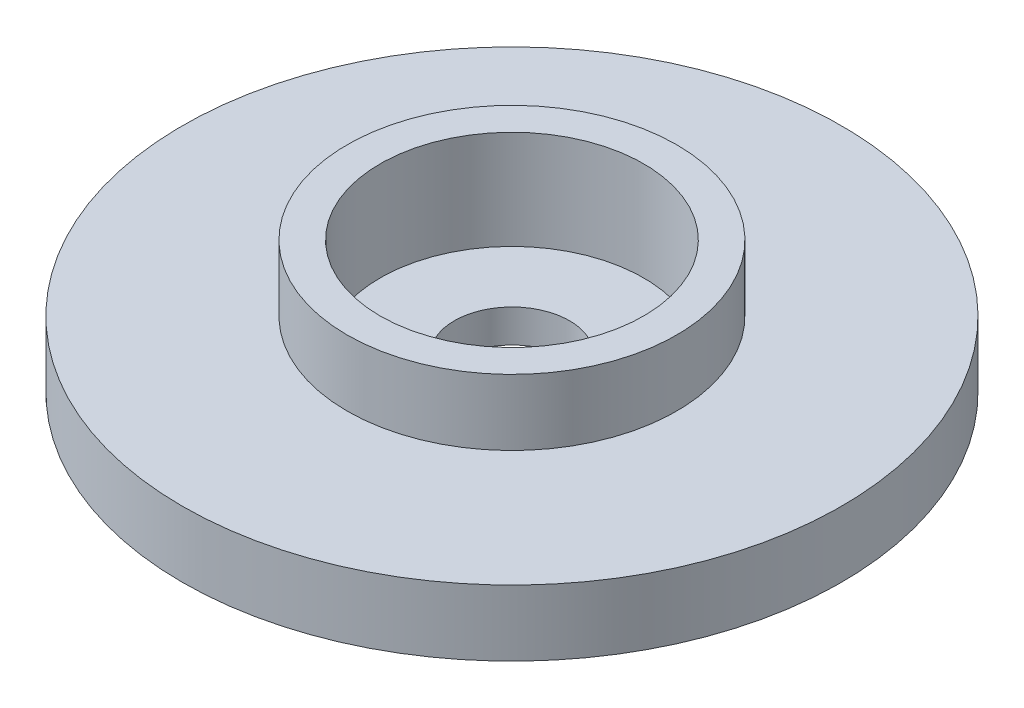
ISO-10303-21;
HEADER;
FILE_DESCRIPTION(('STEP AP214'),'2;1');
FILE_NAME('part.step','',(''),(''),'','','');
FILE_SCHEMA(('AUTOMOTIVE_DESIGN { 1 0 10303 214 1 1 1 1 }'));
ENDSEC;
DATA;
#1=APPLICATION_CONTEXT('core data for automotive mechanical design processes');
#2=APPLICATION_PROTOCOL_DEFINITION('international standard','automotive_design',2000,#1);
#3=PRODUCT_CONTEXT('',#1,'mechanical');
#4=PRODUCT('Part','Part','',(#3));
#5=PRODUCT_RELATED_PRODUCT_CATEGORY('part','',(#4));
#6=PRODUCT_DEFINITION_FORMATION('','',#4);
#7=PRODUCT_DEFINITION_CONTEXT('part definition',#1,'design');
#8=PRODUCT_DEFINITION('design','',#6,#7);
#9=PRODUCT_DEFINITION_SHAPE('','',#8);
#10=(LENGTH_UNIT() NAMED_UNIT(*) SI_UNIT(.MILLI.,.METRE.));
#11=(NAMED_UNIT(*) PLANE_ANGLE_UNIT() SI_UNIT($,.RADIAN.));
#12=(NAMED_UNIT(*) SI_UNIT($,.STERADIAN.) SOLID_ANGLE_UNIT());
#13=UNCERTAINTY_MEASURE_WITH_UNIT(LENGTH_MEASURE(1.E-05),#10,'distance_accuracy_value','');
#14=(GEOMETRIC_REPRESENTATION_CONTEXT(3) GLOBAL_UNCERTAINTY_ASSIGNED_CONTEXT((#13)) GLOBAL_UNIT_ASSIGNED_CONTEXT((#10,
#11,#12)) REPRESENTATION_CONTEXT('',''));
#15=CARTESIAN_POINT('',(0.,0.,0.));
#16=DIRECTION('',(0.,0.,1.));
#17=DIRECTION('',(1.,0.,0.));
#18=AXIS2_PLACEMENT_3D('',#15,#16,#17);
#19=CARTESIAN_POINT('',(0.,0.574222431668237,0.));
#20=DIRECTION('',(0.,1.,0.));
#21=DIRECTION('',(0.,0.,1.));
#22=AXIS2_PLACEMENT_3D('',#19,#20,#21);
#23=CYLINDRICAL_SURFACE('',#22,0.875);
#24=CARTESIAN_POINT('',(0.,0.574222431668237,0.));
#25=DIRECTION('',(0.,1.,0.));
#26=DIRECTION('',(0.,0.,1.));
#27=AXIS2_PLACEMENT_3D('',#24,#25,#26);
#28=CIRCLE('',#27,0.875);
#29=CARTESIAN_POINT('',(0.,0.574222431668237,0.875));
#30=VERTEX_POINT('',#29);
#31=EDGE_CURVE('E51',#30,#30,#28,.T.);
#32=ORIENTED_EDGE('',*,*,#31,.F.);
#33=EDGE_LOOP('',(#32));
#34=FACE_BOUND('',#33,.T.);
#35=CARTESIAN_POINT('',(0.,1.07422243166824,0.));
#36=DIRECTION('',(0.,1.,0.));
#37=DIRECTION('',(0.,0.,1.));
#38=AXIS2_PLACEMENT_3D('',#35,#36,#37);
#39=CIRCLE('',#38,0.875);
#40=CARTESIAN_POINT('',(0.,1.07422243166824,0.875));
#41=VERTEX_POINT('',#40);
#42=EDGE_CURVE('E37',#41,#41,#39,.F.);
#43=ORIENTED_EDGE('',*,*,#42,.F.);
#44=EDGE_LOOP('',(#43));
#45=FACE_BOUND('',#44,.T.);
#46=ADVANCED_FACE('F33',(#34,#45),#23,.F.);
#47=CARTESIAN_POINT('',(0.,1.57422243166824,0.));
#48=DIRECTION('',(0.,-1.,0.));
#49=DIRECTION('',(0.,0.,-1.));
#50=AXIS2_PLACEMENT_3D('',#47,#48,#49);
#51=CYLINDRICAL_SURFACE('',#50,5.);
#52=CARTESIAN_POINT('',(0.,1.57422243166824,0.));
#53=DIRECTION('',(0.,1.,0.));
#54=DIRECTION('',(0.,0.,1.));
#55=AXIS2_PLACEMENT_3D('',#52,#53,#54);
#56=CIRCLE('',#55,5.);
#57=CARTESIAN_POINT('',(0.,1.57422243166824,5.));
#58=VERTEX_POINT('',#57);
#59=EDGE_CURVE('E10',#58,#58,#56,.T.);
#60=ORIENTED_EDGE('',*,*,#59,.F.);
#61=EDGE_LOOP('',(#60));
#62=FACE_BOUND('',#61,.T.);
#63=CARTESIAN_POINT('',(0.,0.574222431668237,0.));
#64=DIRECTION('',(0.,1.,0.));
#65=DIRECTION('',(0.,0.,1.));
#66=AXIS2_PLACEMENT_3D('',#63,#64,#65);
#67=CIRCLE('',#66,5.);
#68=CARTESIAN_POINT('',(0.,0.574222431668237,5.));
#69=VERTEX_POINT('',#68);
#70=EDGE_CURVE('E41',#69,#69,#67,.T.);
#71=ORIENTED_EDGE('',*,*,#70,.T.);
#72=EDGE_LOOP('',(#71));
#73=FACE_BOUND('',#72,.T.);
#74=ADVANCED_FACE('F35',(#62,#73),#51,.T.);
#75=CARTESIAN_POINT('',(0.,1.57422243166824,0.));
#76=DIRECTION('',(0.,1.,0.));
#77=DIRECTION('',(0.,0.,1.));
#78=AXIS2_PLACEMENT_3D('',#75,#76,#77);
#79=PLANE('',#78);
#80=CARTESIAN_POINT('',(0.,1.57422243166824,0.));
#81=DIRECTION('',(0.,1.,0.));
#82=DIRECTION('',(0.,0.,1.));
#83=AXIS2_PLACEMENT_3D('',#80,#81,#82);
#84=CIRCLE('',#83,2.5);
#85=CARTESIAN_POINT('',(0.,1.57422243166824,2.5));
#86=VERTEX_POINT('',#85);
#87=EDGE_CURVE('E48',#86,#86,#84,.T.);
#88=ORIENTED_EDGE('',*,*,#87,.F.);
#89=EDGE_LOOP('',(#88));
#90=FACE_BOUND('',#89,.T.);
#91=ORIENTED_EDGE('',*,*,#59,.T.);
#92=EDGE_LOOP('',(#91));
#93=FACE_BOUND('',#92,.T.);
#94=ADVANCED_FACE('F74',(#90,#93),#79,.T.);
#95=CARTESIAN_POINT('',(0.,0.574222431668237,0.));
#96=DIRECTION('',(0.,1.,0.));
#97=DIRECTION('',(0.,0.,1.));
#98=AXIS2_PLACEMENT_3D('',#95,#96,#97);
#99=PLANE('',#98);
#100=ORIENTED_EDGE('',*,*,#31,.T.);
#101=EDGE_LOOP('',(#100));
#102=FACE_BOUND('',#101,.T.);
#103=ORIENTED_EDGE('',*,*,#70,.F.);
#104=EDGE_LOOP('',(#103));
#105=FACE_BOUND('',#104,.T.);
#106=ADVANCED_FACE('F88',(#102,#105),#99,.F.);
#107=CARTESIAN_POINT('',(0.,2.57422243166824,0.));
#108=DIRECTION('',(0.,-1.,0.));
#109=DIRECTION('',(0.,0.,-1.));
#110=AXIS2_PLACEMENT_3D('',#107,#108,#109);
#111=CYLINDRICAL_SURFACE('',#110,2.5);
#112=CARTESIAN_POINT('',(0.,2.57422243166824,0.));
#113=DIRECTION('',(0.,1.,0.));
#114=DIRECTION('',(0.,0.,1.));
#115=AXIS2_PLACEMENT_3D('',#112,#113,#114);
#116=CIRCLE('',#115,2.5);
#117=CARTESIAN_POINT('',(0.,2.57422243166824,2.5));
#118=VERTEX_POINT('',#117);
#119=EDGE_CURVE('E46',#118,#118,#116,.T.);
#120=ORIENTED_EDGE('',*,*,#119,.F.);
#121=EDGE_LOOP('',(#120));
#122=FACE_BOUND('',#121,.T.);
#123=ORIENTED_EDGE('',*,*,#87,.T.);
#124=EDGE_LOOP('',(#123));
#125=FACE_BOUND('',#124,.T.);
#126=ADVANCED_FACE('F84',(#122,#125),#111,.T.);
#127=CARTESIAN_POINT('',(0.,2.57422243166824,0.));
#128=DIRECTION('',(0.,1.,0.));
#129=DIRECTION('',(0.,0.,1.));
#130=AXIS2_PLACEMENT_3D('',#127,#128,#129);
#131=PLANE('',#130);
#132=CARTESIAN_POINT('',(0.,2.57422243166824,0.));
#133=DIRECTION('',(0.,1.,0.));
#134=DIRECTION('',(0.,0.,1.));
#135=AXIS2_PLACEMENT_3D('',#132,#133,#134);
#136=CIRCLE('',#135,2.);
#137=CARTESIAN_POINT('',(0.,2.57422243166824,2.));
#138=VERTEX_POINT('',#137);
#139=EDGE_CURVE('E56',#138,#138,#136,.T.);
#140=ORIENTED_EDGE('',*,*,#139,.F.);
#141=EDGE_LOOP('',(#140));
#142=FACE_BOUND('',#141,.T.);
#143=ORIENTED_EDGE('',*,*,#119,.T.);
#144=EDGE_LOOP('',(#143));
#145=FACE_BOUND('',#144,.T.);
#146=ADVANCED_FACE('F81',(#142,#145),#131,.T.);
#147=CARTESIAN_POINT('',(0.,1.07422243166824,0.));
#148=DIRECTION('',(0.,1.,0.));
#149=DIRECTION('',(0.,0.,1.));
#150=AXIS2_PLACEMENT_3D('',#147,#148,#149);
#151=PLANE('',#150);
#152=CARTESIAN_POINT('',(0.,1.07422243166824,0.));
#153=DIRECTION('',(0.,1.,0.));
#154=DIRECTION('',(0.,0.,1.));
#155=AXIS2_PLACEMENT_3D('',#152,#153,#154);
#156=CIRCLE('',#155,2.);
#157=CARTESIAN_POINT('',(0.,1.07422243166824,2.));
#158=VERTEX_POINT('',#157);
#159=EDGE_CURVE('E59',#158,#158,#156,.T.);
#160=ORIENTED_EDGE('',*,*,#159,.T.);
#161=EDGE_LOOP('',(#160));
#162=FACE_BOUND('',#161,.T.);
#163=ORIENTED_EDGE('',*,*,#42,.T.);
#164=EDGE_LOOP('',(#163));
#165=FACE_BOUND('',#164,.T.);
#166=ADVANCED_FACE('F66',(#162,#165),#151,.T.);
#167=CARTESIAN_POINT('',(0.,1.07422243166824,0.));
#168=DIRECTION('',(0.,1.,0.));
#169=DIRECTION('',(0.,0.,1.));
#170=AXIS2_PLACEMENT_3D('',#167,#168,#169);
#171=CYLINDRICAL_SURFACE('',#170,2.);
#172=ORIENTED_EDGE('',*,*,#159,.F.);
#173=EDGE_LOOP('',(#172));
#174=FACE_BOUND('',#173,.T.);
#175=ORIENTED_EDGE('',*,*,#139,.T.);
#176=EDGE_LOOP('',(#175));
#177=FACE_BOUND('',#176,.T.);
#178=ADVANCED_FACE('F79',(#174,#177),#171,.F.);
#179=CLOSED_SHELL('',(#46,#74,#94,#106,#126,#146,#166,#178));
#180=MANIFOLD_SOLID_BREP('B2',#179);
#181=ADVANCED_BREP_SHAPE_REPRESENTATION('',(#18,#180),#14);
#182=SHAPE_DEFINITION_REPRESENTATION(#9,#181);
ENDSEC;
END-ISO-10303-21;
